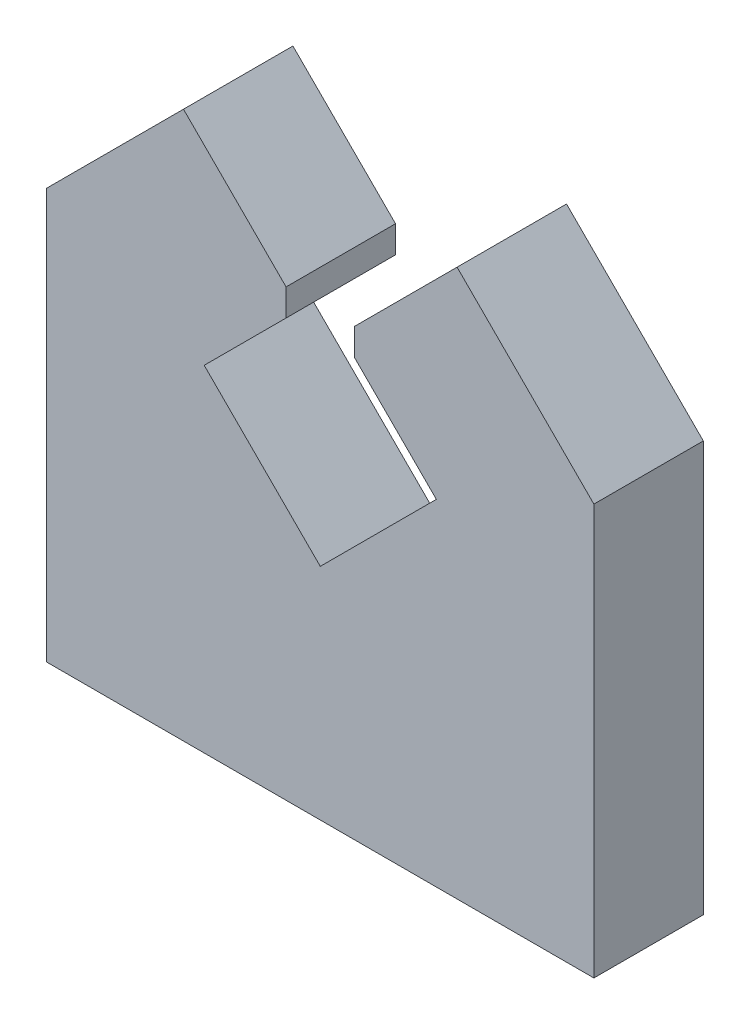
ISO-10303-21;
HEADER;
FILE_DESCRIPTION(('STEP AP214'),'2;1');
FILE_NAME('part.step','',(''),(''),'','','');
FILE_SCHEMA(('AUTOMOTIVE_DESIGN { 1 0 10303 214 1 1 1 1 }'));
ENDSEC;
DATA;
#1=APPLICATION_CONTEXT('core data for automotive mechanical design processes');
#2=APPLICATION_PROTOCOL_DEFINITION('international standard','automotive_design',2000,#1);
#3=PRODUCT_CONTEXT('',#1,'mechanical');
#4=PRODUCT('Part','Part','',(#3));
#5=PRODUCT_RELATED_PRODUCT_CATEGORY('part','',(#4));
#6=PRODUCT_DEFINITION_FORMATION('','',#4);
#7=PRODUCT_DEFINITION_CONTEXT('part definition',#1,'design');
#8=PRODUCT_DEFINITION('design','',#6,#7);
#9=PRODUCT_DEFINITION_SHAPE('','',#8);
#10=(LENGTH_UNIT() NAMED_UNIT(*) SI_UNIT(.MILLI.,.METRE.));
#11=(NAMED_UNIT(*) PLANE_ANGLE_UNIT() SI_UNIT($,.RADIAN.));
#12=(NAMED_UNIT(*) SI_UNIT($,.STERADIAN.) SOLID_ANGLE_UNIT());
#13=UNCERTAINTY_MEASURE_WITH_UNIT(LENGTH_MEASURE(1.E-05),#10,'distance_accuracy_value','');
#14=(GEOMETRIC_REPRESENTATION_CONTEXT(3) GLOBAL_UNCERTAINTY_ASSIGNED_CONTEXT((#13)) GLOBAL_UNIT_ASSIGNED_CONTEXT((#10,
#11,#12)) REPRESENTATION_CONTEXT('',''));
#15=CARTESIAN_POINT('',(0.,0.,0.));
#16=DIRECTION('',(0.,0.,1.));
#17=DIRECTION('',(1.,0.,0.));
#18=AXIS2_PLACEMENT_3D('',#15,#16,#17);
#19=CARTESIAN_POINT('',(0.,0.,80.));
#20=DIRECTION('',(-1.,0.,0.));
#21=DIRECTION('',(0.,0.,1.));
#22=AXIS2_PLACEMENT_3D('',#19,#20,#21);
#23=PLANE('',#22);
#24=DIRECTION('',(0.,1.,0.));
#25=VECTOR('',#24,1.);
#26=CARTESIAN_POINT('',(0.,0.,0.));
#27=LINE('',#26,#25);
#28=CARTESIAN_POINT('',(0.,0.,0.));
#29=VERTEX_POINT('',#28);
#30=CARTESIAN_POINT('',(0.,299.999999999999,0.));
#31=VERTEX_POINT('',#30);
#32=EDGE_CURVE('E161',#29,#31,#27,.T.);
#33=ORIENTED_EDGE('',*,*,#32,.F.);
#34=DIRECTION('',(0.,0.,-1.));
#35=VECTOR('',#34,1.);
#36=CARTESIAN_POINT('',(0.,0.,80.));
#37=LINE('',#36,#35);
#38=CARTESIAN_POINT('',(0.,0.,80.));
#39=VERTEX_POINT('',#38);
#40=EDGE_CURVE('E11',#39,#29,#37,.T.);
#41=ORIENTED_EDGE('',*,*,#40,.F.);
#42=DIRECTION('',(0.,1.,0.));
#43=VECTOR('',#42,1.);
#44=CARTESIAN_POINT('',(0.,0.,80.));
#45=LINE('',#44,#43);
#46=CARTESIAN_POINT('',(0.,299.999999999999,80.));
#47=VERTEX_POINT('',#46);
#48=EDGE_CURVE('E194',#39,#47,#45,.T.);
#49=ORIENTED_EDGE('',*,*,#48,.T.);
#50=DIRECTION('',(0.,0.,-1.));
#51=VECTOR('',#50,1.);
#52=CARTESIAN_POINT('',(0.,299.999999999999,80.));
#53=LINE('',#52,#51);
#54=EDGE_CURVE('E35',#47,#31,#53,.T.);
#55=ORIENTED_EDGE('',*,*,#54,.T.);
#56=EDGE_LOOP('',(#33,#41,#49,#55));
#57=FACE_BOUND('',#56,.T.);
#58=ADVANCED_FACE('F32',(#57),#23,.T.);
#59=CARTESIAN_POINT('',(0.,0.,80.));
#60=DIRECTION('',(0.,1.,0.));
#61=DIRECTION('',(0.,0.,1.));
#62=AXIS2_PLACEMENT_3D('',#59,#60,#61);
#63=PLANE('',#62);
#64=DIRECTION('',(1.,0.,0.));
#65=VECTOR('',#64,1.);
#66=CARTESIAN_POINT('',(0.,0.,0.));
#67=LINE('',#66,#65);
#68=CARTESIAN_POINT('',(400.,0.,0.));
#69=VERTEX_POINT('',#68);
#70=EDGE_CURVE('E92',#29,#69,#67,.T.);
#71=ORIENTED_EDGE('',*,*,#70,.T.);
#72=DIRECTION('',(0.,0.,-1.));
#73=VECTOR('',#72,1.);
#74=CARTESIAN_POINT('',(400.,0.,80.));
#75=LINE('',#74,#73);
#76=CARTESIAN_POINT('',(400.,0.,80.));
#77=VERTEX_POINT('',#76);
#78=EDGE_CURVE('E41',#77,#69,#75,.T.);
#79=ORIENTED_EDGE('',*,*,#78,.F.);
#80=DIRECTION('',(1.,0.,0.));
#81=VECTOR('',#80,1.);
#82=CARTESIAN_POINT('',(0.,0.,80.));
#83=LINE('',#82,#81);
#84=EDGE_CURVE('E140',#39,#77,#83,.T.);
#85=ORIENTED_EDGE('',*,*,#84,.F.);
#86=ORIENTED_EDGE('',*,*,#40,.T.);
#87=EDGE_LOOP('',(#71,#79,#85,#86));
#88=FACE_BOUND('',#87,.T.);
#89=ADVANCED_FACE('F277',(#88),#63,.F.);
#90=CARTESIAN_POINT('',(400.,0.,80.));
#91=DIRECTION('',(-1.,0.,0.));
#92=DIRECTION('',(0.,0.,1.));
#93=AXIS2_PLACEMENT_3D('',#90,#91,#92);
#94=PLANE('',#93);
#95=DIRECTION('',(0.,1.,0.));
#96=VECTOR('',#95,1.);
#97=CARTESIAN_POINT('',(400.,0.,0.));
#98=LINE('',#97,#96);
#99=CARTESIAN_POINT('',(400.,299.999999999998,0.));
#100=VERTEX_POINT('',#99);
#101=EDGE_CURVE('E147',#69,#100,#98,.T.);
#102=ORIENTED_EDGE('',*,*,#101,.T.);
#103=DIRECTION('',(0.,0.,-1.));
#104=VECTOR('',#103,1.);
#105=CARTESIAN_POINT('',(400.,299.999999999998,80.));
#106=LINE('',#105,#104);
#107=CARTESIAN_POINT('',(400.,299.999999999998,80.));
#108=VERTEX_POINT('',#107);
#109=EDGE_CURVE('E144',#108,#100,#106,.T.);
#110=ORIENTED_EDGE('',*,*,#109,.F.);
#111=DIRECTION('',(0.,1.,0.));
#112=VECTOR('',#111,1.);
#113=CARTESIAN_POINT('',(400.,0.,80.));
#114=LINE('',#113,#112);
#115=EDGE_CURVE('E132',#77,#108,#114,.T.);
#116=ORIENTED_EDGE('',*,*,#115,.F.);
#117=ORIENTED_EDGE('',*,*,#78,.T.);
#118=EDGE_LOOP('',(#102,#110,#116,#117));
#119=FACE_BOUND('',#118,.T.);
#120=ADVANCED_FACE('F145',(#119),#94,.F.);
#121=CARTESIAN_POINT('',(300.,400.,80.));
#122=DIRECTION('',(0.707106781186554,0.707106781186541,0.));
#123=DIRECTION('',(-0.707106781186541,0.707106781186554,0.));
#124=AXIS2_PLACEMENT_3D('',#121,#122,#123);
#125=PLANE('',#124);
#126=DIRECTION('',(0.707106781186541,-0.707106781186554,0.));
#127=VECTOR('',#126,1.);
#128=CARTESIAN_POINT('',(300.,400.,0.));
#129=LINE('',#128,#127);
#130=CARTESIAN_POINT('',(300.,400.,0.));
#131=VERTEX_POINT('',#130);
#132=EDGE_CURVE('E191',#131,#100,#129,.T.);
#133=ORIENTED_EDGE('',*,*,#132,.F.);
#134=DIRECTION('',(0.,0.,-1.));
#135=VECTOR('',#134,1.);
#136=CARTESIAN_POINT('',(300.,400.,80.));
#137=LINE('',#136,#135);
#138=CARTESIAN_POINT('',(300.,400.,80.));
#139=VERTEX_POINT('',#138);
#140=EDGE_CURVE('E151',#139,#131,#137,.T.);
#141=ORIENTED_EDGE('',*,*,#140,.F.);
#142=DIRECTION('',(0.707106781186541,-0.707106781186554,0.));
#143=VECTOR('',#142,1.);
#144=CARTESIAN_POINT('',(300.,400.,80.));
#145=LINE('',#144,#143);
#146=EDGE_CURVE('E138',#139,#108,#145,.T.);
#147=ORIENTED_EDGE('',*,*,#146,.T.);
#148=ORIENTED_EDGE('',*,*,#109,.T.);
#149=EDGE_LOOP('',(#133,#141,#147,#148));
#150=FACE_BOUND('',#149,.T.);
#151=ADVANCED_FACE('F153',(#150),#125,.T.);
#152=CARTESIAN_POINT('',(225.,325.,80.));
#153=DIRECTION('',(-0.707106781186548,0.707106781186547,0.));
#154=DIRECTION('',(-0.707106781186547,-0.707106781186548,0.));
#155=AXIS2_PLACEMENT_3D('',#152,#153,#154);
#156=PLANE('',#155);
#157=DIRECTION('',(0.707106781186547,0.707106781186548,0.));
#158=VECTOR('',#157,1.);
#159=CARTESIAN_POINT('',(225.,325.,0.));
#160=LINE('',#159,#158);
#161=CARTESIAN_POINT('',(225.,325.,0.));
#162=VERTEX_POINT('',#161);
#163=EDGE_CURVE('E188',#162,#131,#160,.T.);
#164=ORIENTED_EDGE('',*,*,#163,.F.);
#165=DIRECTION('',(0.,0.,-1.));
#166=VECTOR('',#165,1.);
#167=CARTESIAN_POINT('',(225.,325.,80.));
#168=LINE('',#167,#166);
#169=CARTESIAN_POINT('',(225.,325.,80.));
#170=VERTEX_POINT('',#169);
#171=EDGE_CURVE('E198',#170,#162,#168,.T.);
#172=ORIENTED_EDGE('',*,*,#171,.F.);
#173=DIRECTION('',(0.707106781186547,0.707106781186548,0.));
#174=VECTOR('',#173,1.);
#175=CARTESIAN_POINT('',(225.,325.,80.));
#176=LINE('',#175,#174);
#177=EDGE_CURVE('E154',#170,#139,#176,.T.);
#178=ORIENTED_EDGE('',*,*,#177,.T.);
#179=ORIENTED_EDGE('',*,*,#140,.T.);
#180=EDGE_LOOP('',(#164,#172,#178,#179));
#181=FACE_BOUND('',#180,.T.);
#182=ADVANCED_FACE('F219',(#181),#156,.T.);
#183=CARTESIAN_POINT('',(225.,305.294372515228,80.));
#184=DIRECTION('',(-1.,0.,0.));
#185=DIRECTION('',(0.,0.,1.));
#186=AXIS2_PLACEMENT_3D('',#183,#184,#185);
#187=PLANE('',#186);
#188=DIRECTION('',(0.,1.,0.));
#189=VECTOR('',#188,1.);
#190=CARTESIAN_POINT('',(225.,305.294372515228,0.));
#191=LINE('',#190,#189);
#192=CARTESIAN_POINT('',(225.,305.294372515228,0.));
#193=VERTEX_POINT('',#192);
#194=EDGE_CURVE('E185',#193,#162,#191,.T.);
#195=ORIENTED_EDGE('',*,*,#194,.F.);
#196=DIRECTION('',(0.,0.,-1.));
#197=VECTOR('',#196,1.);
#198=CARTESIAN_POINT('',(225.,305.294372515228,80.));
#199=LINE('',#198,#197);
#200=CARTESIAN_POINT('',(225.,305.294372515228,80.));
#201=VERTEX_POINT('',#200);
#202=EDGE_CURVE('E200',#201,#193,#199,.T.);
#203=ORIENTED_EDGE('',*,*,#202,.F.);
#204=DIRECTION('',(0.,1.,0.));
#205=VECTOR('',#204,1.);
#206=CARTESIAN_POINT('',(225.,305.294372515228,80.));
#207=LINE('',#206,#205);
#208=EDGE_CURVE('E156',#201,#170,#207,.T.);
#209=ORIENTED_EDGE('',*,*,#208,.T.);
#210=ORIENTED_EDGE('',*,*,#171,.T.);
#211=EDGE_LOOP('',(#195,#203,#209,#210));
#212=FACE_BOUND('',#211,.T.);
#213=ADVANCED_FACE('F225',(#212),#187,.T.);
#214=CARTESIAN_POINT('',(284.852813742386,245.441558772842,80.));
#215=DIRECTION('',(-0.707106781186549,-0.707106781186547,0.));
#216=DIRECTION('',(0.707106781186547,-0.707106781186549,0.));
#217=AXIS2_PLACEMENT_3D('',#214,#215,#216);
#218=PLANE('',#217);
#219=DIRECTION('',(-0.707106781186547,0.707106781186549,0.));
#220=VECTOR('',#219,1.);
#221=CARTESIAN_POINT('',(284.852813742386,245.441558772842,0.));
#222=LINE('',#221,#220);
#223=CARTESIAN_POINT('',(284.852813742386,245.441558772842,0.));
#224=VERTEX_POINT('',#223);
#225=EDGE_CURVE('E182',#224,#193,#222,.T.);
#226=ORIENTED_EDGE('',*,*,#225,.F.);
#227=DIRECTION('',(0.,0.,-1.));
#228=VECTOR('',#227,1.);
#229=CARTESIAN_POINT('',(284.852813742386,245.441558772842,80.));
#230=LINE('',#229,#228);
#231=CARTESIAN_POINT('',(284.852813742386,245.441558772842,80.));
#232=VERTEX_POINT('',#231);
#233=EDGE_CURVE('E202',#232,#224,#230,.T.);
#234=ORIENTED_EDGE('',*,*,#233,.F.);
#235=DIRECTION('',(-0.707106781186547,0.707106781186549,0.));
#236=VECTOR('',#235,1.);
#237=CARTESIAN_POINT('',(284.852813742386,245.441558772842,80.));
#238=LINE('',#237,#236);
#239=EDGE_CURVE('E226',#232,#201,#238,.T.);
#240=ORIENTED_EDGE('',*,*,#239,.T.);
#241=ORIENTED_EDGE('',*,*,#202,.T.);
#242=EDGE_LOOP('',(#226,#234,#240,#241));
#243=FACE_BOUND('',#242,.T.);
#244=ADVANCED_FACE('F267',(#243),#218,.T.);
#245=CARTESIAN_POINT('',(200.,160.588745030456,80.));
#246=DIRECTION('',(-0.707106781186547,0.707106781186548,0.));
#247=DIRECTION('',(-0.707106781186548,-0.707106781186547,0.));
#248=AXIS2_PLACEMENT_3D('',#245,#246,#247);
#249=PLANE('',#248);
#250=DIRECTION('',(0.707106781186548,0.707106781186547,0.));
#251=VECTOR('',#250,1.);
#252=CARTESIAN_POINT('',(200.,160.588745030456,0.));
#253=LINE('',#252,#251);
#254=CARTESIAN_POINT('',(200.,160.588745030456,0.));
#255=VERTEX_POINT('',#254);
#256=EDGE_CURVE('E179',#255,#224,#253,.T.);
#257=ORIENTED_EDGE('',*,*,#256,.F.);
#258=DIRECTION('',(0.,0.,-1.));
#259=VECTOR('',#258,1.);
#260=CARTESIAN_POINT('',(200.,160.588745030456,80.));
#261=LINE('',#260,#259);
#262=CARTESIAN_POINT('',(200.,160.588745030456,80.));
#263=VERTEX_POINT('',#262);
#264=EDGE_CURVE('E204',#263,#255,#261,.T.);
#265=ORIENTED_EDGE('',*,*,#264,.F.);
#266=DIRECTION('',(0.707106781186548,0.707106781186547,0.));
#267=VECTOR('',#266,1.);
#268=CARTESIAN_POINT('',(200.,160.588745030456,80.));
#269=LINE('',#268,#267);
#270=EDGE_CURVE('E227',#263,#232,#269,.T.);
#271=ORIENTED_EDGE('',*,*,#270,.T.);
#272=ORIENTED_EDGE('',*,*,#233,.T.);
#273=EDGE_LOOP('',(#257,#265,#271,#272));
#274=FACE_BOUND('',#273,.T.);
#275=ADVANCED_FACE('F264',(#274),#249,.T.);
#276=CARTESIAN_POINT('',(115.147186257614,245.441558772842,80.));
#277=DIRECTION('',(0.707106781186549,0.707106781186546,0.));
#278=DIRECTION('',(-0.707106781186546,0.707106781186549,0.));
#279=AXIS2_PLACEMENT_3D('',#276,#277,#278);
#280=PLANE('',#279);
#281=DIRECTION('',(0.707106781186546,-0.707106781186549,0.));
#282=VECTOR('',#281,1.);
#283=CARTESIAN_POINT('',(115.147186257614,245.441558772842,0.));
#284=LINE('',#283,#282);
#285=CARTESIAN_POINT('',(115.147186257614,245.441558772842,0.));
#286=VERTEX_POINT('',#285);
#287=EDGE_CURVE('E176',#286,#255,#284,.T.);
#288=ORIENTED_EDGE('',*,*,#287,.F.);
#289=DIRECTION('',(0.,0.,-1.));
#290=VECTOR('',#289,1.);
#291=CARTESIAN_POINT('',(115.147186257614,245.441558772842,80.));
#292=LINE('',#291,#290);
#293=CARTESIAN_POINT('',(115.147186257614,245.441558772842,80.));
#294=VERTEX_POINT('',#293);
#295=EDGE_CURVE('E206',#294,#286,#292,.T.);
#296=ORIENTED_EDGE('',*,*,#295,.F.);
#297=DIRECTION('',(0.707106781186546,-0.707106781186549,0.));
#298=VECTOR('',#297,1.);
#299=CARTESIAN_POINT('',(115.147186257614,245.441558772842,80.));
#300=LINE('',#299,#298);
#301=EDGE_CURVE('E232',#294,#263,#300,.T.);
#302=ORIENTED_EDGE('',*,*,#301,.T.);
#303=ORIENTED_EDGE('',*,*,#264,.T.);
#304=EDGE_LOOP('',(#288,#296,#302,#303));
#305=FACE_BOUND('',#304,.T.);
#306=ADVANCED_FACE('F260',(#305),#280,.T.);
#307=CARTESIAN_POINT('',(175.,305.294372515228,80.));
#308=DIRECTION('',(0.70710678118655,-0.707106781186545,0.));
#309=DIRECTION('',(0.707106781186545,0.70710678118655,0.));
#310=AXIS2_PLACEMENT_3D('',#307,#308,#309);
#311=PLANE('',#310);
#312=DIRECTION('',(-0.707106781186545,-0.70710678118655,0.));
#313=VECTOR('',#312,1.);
#314=CARTESIAN_POINT('',(175.,305.294372515228,0.));
#315=LINE('',#314,#313);
#316=CARTESIAN_POINT('',(175.,305.294372515228,0.));
#317=VERTEX_POINT('',#316);
#318=EDGE_CURVE('E173',#317,#286,#315,.T.);
#319=ORIENTED_EDGE('',*,*,#318,.F.);
#320=DIRECTION('',(0.,0.,-1.));
#321=VECTOR('',#320,1.);
#322=CARTESIAN_POINT('',(175.,305.294372515228,80.));
#323=LINE('',#322,#321);
#324=CARTESIAN_POINT('',(175.,305.294372515228,80.));
#325=VERTEX_POINT('',#324);
#326=EDGE_CURVE('E208',#325,#317,#323,.T.);
#327=ORIENTED_EDGE('',*,*,#326,.F.);
#328=DIRECTION('',(-0.707106781186545,-0.70710678118655,0.));
#329=VECTOR('',#328,1.);
#330=CARTESIAN_POINT('',(175.,305.294372515228,80.));
#331=LINE('',#330,#329);
#332=EDGE_CURVE('E235',#325,#294,#331,.T.);
#333=ORIENTED_EDGE('',*,*,#332,.T.);
#334=ORIENTED_EDGE('',*,*,#295,.T.);
#335=EDGE_LOOP('',(#319,#327,#333,#334));
#336=FACE_BOUND('',#335,.T.);
#337=ADVANCED_FACE('F256',(#336),#311,.T.);
#338=CARTESIAN_POINT('',(175.,324.999999999999,80.));
#339=DIRECTION('',(1.,0.,0.));
#340=DIRECTION('',(0.,1.,0.));
#341=AXIS2_PLACEMENT_3D('',#338,#339,#340);
#342=PLANE('',#341);
#343=DIRECTION('',(0.,-1.,0.));
#344=VECTOR('',#343,1.);
#345=CARTESIAN_POINT('',(175.,324.999999999999,0.));
#346=LINE('',#345,#344);
#347=CARTESIAN_POINT('',(175.,324.999999999999,0.));
#348=VERTEX_POINT('',#347);
#349=EDGE_CURVE('E170',#348,#317,#346,.T.);
#350=ORIENTED_EDGE('',*,*,#349,.F.);
#351=DIRECTION('',(0.,0.,-1.));
#352=VECTOR('',#351,1.);
#353=CARTESIAN_POINT('',(175.,324.999999999999,80.));
#354=LINE('',#353,#352);
#355=CARTESIAN_POINT('',(175.,324.999999999999,80.));
#356=VERTEX_POINT('',#355);
#357=EDGE_CURVE('E210',#356,#348,#354,.T.);
#358=ORIENTED_EDGE('',*,*,#357,.F.);
#359=DIRECTION('',(0.,-1.,0.));
#360=VECTOR('',#359,1.);
#361=CARTESIAN_POINT('',(175.,324.999999999999,80.));
#362=LINE('',#361,#360);
#363=EDGE_CURVE('E238',#356,#325,#362,.T.);
#364=ORIENTED_EDGE('',*,*,#363,.T.);
#365=ORIENTED_EDGE('',*,*,#326,.T.);
#366=EDGE_LOOP('',(#350,#358,#364,#365));
#367=FACE_BOUND('',#366,.T.);
#368=ADVANCED_FACE('F254',(#367),#342,.T.);
#369=CARTESIAN_POINT('',(100.,399.999999999999,80.));
#370=DIRECTION('',(0.707106781186549,0.707106781186546,0.));
#371=DIRECTION('',(-0.707106781186546,0.707106781186549,0.));
#372=AXIS2_PLACEMENT_3D('',#369,#370,#371);
#373=PLANE('',#372);
#374=DIRECTION('',(0.707106781186546,-0.707106781186549,0.));
#375=VECTOR('',#374,1.);
#376=CARTESIAN_POINT('',(100.,399.999999999999,0.));
#377=LINE('',#376,#375);
#378=CARTESIAN_POINT('',(100.,399.999999999999,0.));
#379=VERTEX_POINT('',#378);
#380=EDGE_CURVE('E167',#379,#348,#377,.T.);
#381=ORIENTED_EDGE('',*,*,#380,.F.);
#382=DIRECTION('',(0.,0.,-1.));
#383=VECTOR('',#382,1.);
#384=CARTESIAN_POINT('',(100.,399.999999999999,80.));
#385=LINE('',#384,#383);
#386=CARTESIAN_POINT('',(100.,399.999999999999,80.));
#387=VERTEX_POINT('',#386);
#388=EDGE_CURVE('E211',#387,#379,#385,.T.);
#389=ORIENTED_EDGE('',*,*,#388,.F.);
#390=DIRECTION('',(0.707106781186546,-0.707106781186549,0.));
#391=VECTOR('',#390,1.);
#392=CARTESIAN_POINT('',(100.,399.999999999999,80.));
#393=LINE('',#392,#391);
#394=EDGE_CURVE('E241',#387,#356,#393,.T.);
#395=ORIENTED_EDGE('',*,*,#394,.T.);
#396=ORIENTED_EDGE('',*,*,#357,.T.);
#397=EDGE_LOOP('',(#381,#389,#395,#396));
#398=FACE_BOUND('',#397,.T.);
#399=ADVANCED_FACE('F250',(#398),#373,.T.);
#400=CARTESIAN_POINT('',(0.,299.999999999999,80.));
#401=DIRECTION('',(-0.707106781186546,0.707106781186549,0.));
#402=DIRECTION('',(-0.707106781186549,-0.707106781186546,0.));
#403=AXIS2_PLACEMENT_3D('',#400,#401,#402);
#404=PLANE('',#403);
#405=DIRECTION('',(0.707106781186549,0.707106781186546,0.));
#406=VECTOR('',#405,1.);
#407=CARTESIAN_POINT('',(0.,299.999999999999,0.));
#408=LINE('',#407,#406);
#409=EDGE_CURVE('E164',#31,#379,#408,.T.);
#410=ORIENTED_EDGE('',*,*,#409,.F.);
#411=ORIENTED_EDGE('',*,*,#54,.F.);
#412=DIRECTION('',(0.707106781186549,0.707106781186546,0.));
#413=VECTOR('',#412,1.);
#414=CARTESIAN_POINT('',(0.,299.999999999999,80.));
#415=LINE('',#414,#413);
#416=EDGE_CURVE('E244',#47,#387,#415,.T.);
#417=ORIENTED_EDGE('',*,*,#416,.T.);
#418=ORIENTED_EDGE('',*,*,#388,.T.);
#419=EDGE_LOOP('',(#410,#411,#417,#418));
#420=FACE_BOUND('',#419,.T.);
#421=ADVANCED_FACE('F213',(#420),#404,.T.);
#422=CARTESIAN_POINT('',(0.,0.,80.));
#423=DIRECTION('',(0.,0.,-1.));
#424=DIRECTION('',(-1.,0.,0.));
#425=AXIS2_PLACEMENT_3D('',#422,#423,#424);
#426=PLANE('',#425);
#427=ORIENTED_EDGE('',*,*,#48,.F.);
#428=ORIENTED_EDGE('',*,*,#84,.T.);
#429=ORIENTED_EDGE('',*,*,#115,.T.);
#430=ORIENTED_EDGE('',*,*,#146,.F.);
#431=ORIENTED_EDGE('',*,*,#177,.F.);
#432=ORIENTED_EDGE('',*,*,#208,.F.);
#433=ORIENTED_EDGE('',*,*,#239,.F.);
#434=ORIENTED_EDGE('',*,*,#270,.F.);
#435=ORIENTED_EDGE('',*,*,#301,.F.);
#436=ORIENTED_EDGE('',*,*,#332,.F.);
#437=ORIENTED_EDGE('',*,*,#363,.F.);
#438=ORIENTED_EDGE('',*,*,#394,.F.);
#439=ORIENTED_EDGE('',*,*,#416,.F.);
#440=EDGE_LOOP('',(#427,#428,#429,#430,#431,#432,#433,#434,#435,#436,#437,#438,#439));
#441=FACE_BOUND('',#440,.T.);
#442=ADVANCED_FACE('F135',(#441),#426,.F.);
#443=CARTESIAN_POINT('',(0.,0.,0.));
#444=DIRECTION('',(0.,0.,-1.));
#445=DIRECTION('',(-1.,0.,0.));
#446=AXIS2_PLACEMENT_3D('',#443,#444,#445);
#447=PLANE('',#446);
#448=ORIENTED_EDGE('',*,*,#32,.T.);
#449=ORIENTED_EDGE('',*,*,#409,.T.);
#450=ORIENTED_EDGE('',*,*,#380,.T.);
#451=ORIENTED_EDGE('',*,*,#349,.T.);
#452=ORIENTED_EDGE('',*,*,#318,.T.);
#453=ORIENTED_EDGE('',*,*,#287,.T.);
#454=ORIENTED_EDGE('',*,*,#256,.T.);
#455=ORIENTED_EDGE('',*,*,#225,.T.);
#456=ORIENTED_EDGE('',*,*,#194,.T.);
#457=ORIENTED_EDGE('',*,*,#163,.T.);
#458=ORIENTED_EDGE('',*,*,#132,.T.);
#459=ORIENTED_EDGE('',*,*,#101,.F.);
#460=ORIENTED_EDGE('',*,*,#70,.F.);
#461=EDGE_LOOP('',(#448,#449,#450,#451,#452,#453,#454,#455,#456,#457,#458,#459,#460));
#462=FACE_BOUND('',#461,.T.);
#463=ADVANCED_FACE('F215',(#462),#447,.T.);
#464=CLOSED_SHELL('',(#58,#89,#120,#151,#182,#213,#244,#275,#306,#337,#368,#399,#421,#442,#463));
#465=MANIFOLD_SOLID_BREP('B2',#464);
#466=ADVANCED_BREP_SHAPE_REPRESENTATION('',(#18,#465),#14);
#467=SHAPE_DEFINITION_REPRESENTATION(#9,#466);
ENDSEC;
END-ISO-10303-21;
